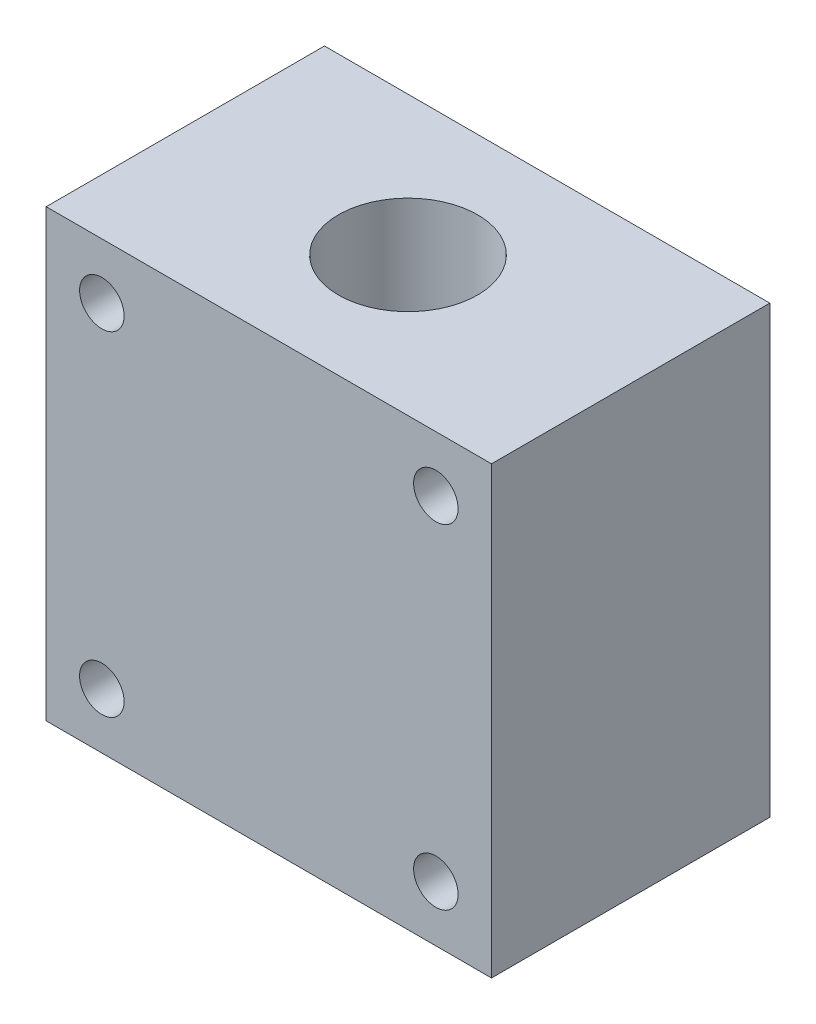
ISO-10303-21;
HEADER;
FILE_DESCRIPTION(('STEP AP214'),'2;1');
FILE_NAME('part.step','',(''),(''),'','','');
FILE_SCHEMA(('AUTOMOTIVE_DESIGN { 1 0 10303 214 1 1 1 1 }'));
ENDSEC;
DATA;
#1=APPLICATION_CONTEXT('core data for automotive mechanical design processes');
#2=APPLICATION_PROTOCOL_DEFINITION('international standard','automotive_design',2000,#1);
#3=PRODUCT_CONTEXT('',#1,'mechanical');
#4=PRODUCT('Part','Part','',(#3));
#5=PRODUCT_RELATED_PRODUCT_CATEGORY('part','',(#4));
#6=PRODUCT_DEFINITION_FORMATION('','',#4);
#7=PRODUCT_DEFINITION_CONTEXT('part definition',#1,'design');
#8=PRODUCT_DEFINITION('design','',#6,#7);
#9=PRODUCT_DEFINITION_SHAPE('','',#8);
#10=(LENGTH_UNIT() NAMED_UNIT(*) SI_UNIT(.MILLI.,.METRE.));
#11=(NAMED_UNIT(*) PLANE_ANGLE_UNIT() SI_UNIT($,.RADIAN.));
#12=(NAMED_UNIT(*) SI_UNIT($,.STERADIAN.) SOLID_ANGLE_UNIT());
#13=UNCERTAINTY_MEASURE_WITH_UNIT(LENGTH_MEASURE(1.E-05),#10,'distance_accuracy_value','');
#14=(GEOMETRIC_REPRESENTATION_CONTEXT(3) GLOBAL_UNCERTAINTY_ASSIGNED_CONTEXT((#13)) GLOBAL_UNIT_ASSIGNED_CONTEXT((#10,
#11,#12)) REPRESENTATION_CONTEXT('',''));
#15=CARTESIAN_POINT('',(0.,0.,0.));
#16=DIRECTION('',(0.,0.,1.));
#17=DIRECTION('',(1.,0.,0.));
#18=AXIS2_PLACEMENT_3D('',#15,#16,#17);
#19=CARTESIAN_POINT('',(-40.,80.,25.));
#20=DIRECTION('',(1.,0.,0.));
#21=DIRECTION('',(0.,0.,-1.));
#22=AXIS2_PLACEMENT_3D('',#19,#20,#21);
#23=PLANE('',#22);
#24=DIRECTION('',(0.,0.,1.));
#25=VECTOR('',#24,1.);
#26=CARTESIAN_POINT('',(-40.,0.,25.));
#27=LINE('',#26,#25);
#28=CARTESIAN_POINT('',(-40.,0.,-25.));
#29=VERTEX_POINT('',#28);
#30=CARTESIAN_POINT('',(-40.,0.,25.));
#31=VERTEX_POINT('',#30);
#32=EDGE_CURVE('E102',#29,#31,#27,.T.);
#33=ORIENTED_EDGE('',*,*,#32,.T.);
#34=DIRECTION('',(0.,-1.,0.));
#35=VECTOR('',#34,1.);
#36=CARTESIAN_POINT('',(-40.,80.,25.));
#37=LINE('',#36,#35);
#38=CARTESIAN_POINT('',(-40.,80.,25.));
#39=VERTEX_POINT('',#38);
#40=EDGE_CURVE('E12',#39,#31,#37,.T.);
#41=ORIENTED_EDGE('',*,*,#40,.F.);
#42=DIRECTION('',(0.,0.,1.));
#43=VECTOR('',#42,1.);
#44=CARTESIAN_POINT('',(-40.,80.,25.));
#45=LINE('',#44,#43);
#46=CARTESIAN_POINT('',(-40.,80.,-25.));
#47=VERTEX_POINT('',#46);
#48=EDGE_CURVE('E90',#47,#39,#45,.T.);
#49=ORIENTED_EDGE('',*,*,#48,.F.);
#50=DIRECTION('',(0.,-1.,0.));
#51=VECTOR('',#50,1.);
#52=CARTESIAN_POINT('',(-40.,80.,-25.));
#53=LINE('',#52,#51);
#54=EDGE_CURVE('E98',#47,#29,#53,.T.);
#55=ORIENTED_EDGE('',*,*,#54,.T.);
#56=EDGE_LOOP('',(#33,#41,#49,#55));
#57=FACE_BOUND('',#56,.T.);
#58=ADVANCED_FACE('F39',(#57),#23,.F.);
#59=CARTESIAN_POINT('',(40.,80.,25.));
#60=DIRECTION('',(0.,0.,-1.));
#61=DIRECTION('',(-1.,0.,0.));
#62=AXIS2_PLACEMENT_3D('',#59,#60,#61);
#63=PLANE('',#62);
#64=CARTESIAN_POINT('',(30.,70.,25.));
#65=DIRECTION('',(0.,0.,1.));
#66=DIRECTION('',(1.,0.,0.));
#67=AXIS2_PLACEMENT_3D('',#64,#65,#66);
#68=CIRCLE('',#67,4.00000000000001);
#69=CARTESIAN_POINT('',(34.,70.,25.));
#70=VERTEX_POINT('',#69);
#71=EDGE_CURVE('E131',#70,#70,#68,.T.);
#72=ORIENTED_EDGE('',*,*,#71,.F.);
#73=EDGE_LOOP('',(#72));
#74=FACE_BOUND('',#73,.T.);
#75=CARTESIAN_POINT('',(30.,10.,25.));
#76=DIRECTION('',(0.,0.,1.));
#77=DIRECTION('',(1.,0.,0.));
#78=AXIS2_PLACEMENT_3D('',#75,#76,#77);
#79=CIRCLE('',#78,4.);
#80=CARTESIAN_POINT('',(34.,10.,25.));
#81=VERTEX_POINT('',#80);
#82=EDGE_CURVE('E137',#81,#81,#79,.T.);
#83=ORIENTED_EDGE('',*,*,#82,.F.);
#84=EDGE_LOOP('',(#83));
#85=FACE_BOUND('',#84,.T.);
#86=CARTESIAN_POINT('',(-30.,10.,25.));
#87=DIRECTION('',(0.,0.,1.));
#88=DIRECTION('',(1.,0.,0.));
#89=AXIS2_PLACEMENT_3D('',#86,#87,#88);
#90=CIRCLE('',#89,4.);
#91=CARTESIAN_POINT('',(-26.,10.,25.));
#92=VERTEX_POINT('',#91);
#93=EDGE_CURVE('E125',#92,#92,#90,.T.);
#94=ORIENTED_EDGE('',*,*,#93,.F.);
#95=EDGE_LOOP('',(#94));
#96=FACE_BOUND('',#95,.T.);
#97=CARTESIAN_POINT('',(-30.,70.,25.));
#98=DIRECTION('',(0.,0.,1.));
#99=DIRECTION('',(1.,0.,0.));
#100=AXIS2_PLACEMENT_3D('',#97,#98,#99);
#101=CIRCLE('',#100,4.);
#102=CARTESIAN_POINT('',(-26.,70.,25.));
#103=VERTEX_POINT('',#102);
#104=EDGE_CURVE('E122',#103,#103,#101,.T.);
#105=ORIENTED_EDGE('',*,*,#104,.F.);
#106=EDGE_LOOP('',(#105));
#107=FACE_BOUND('',#106,.T.);
#108=DIRECTION('',(1.,0.,0.));
#109=VECTOR('',#108,1.);
#110=CARTESIAN_POINT('',(40.,0.,25.));
#111=LINE('',#110,#109);
#112=CARTESIAN_POINT('',(40.,0.,25.));
#113=VERTEX_POINT('',#112);
#114=EDGE_CURVE('E94',#31,#113,#111,.T.);
#115=ORIENTED_EDGE('',*,*,#114,.T.);
#116=DIRECTION('',(0.,-1.,0.));
#117=VECTOR('',#116,1.);
#118=CARTESIAN_POINT('',(40.,80.,25.));
#119=LINE('',#118,#117);
#120=CARTESIAN_POINT('',(40.,80.,25.));
#121=VERTEX_POINT('',#120);
#122=EDGE_CURVE('E47',#121,#113,#119,.T.);
#123=ORIENTED_EDGE('',*,*,#122,.F.);
#124=DIRECTION('',(1.,0.,0.));
#125=VECTOR('',#124,1.);
#126=CARTESIAN_POINT('',(40.,80.,25.));
#127=LINE('',#126,#125);
#128=EDGE_CURVE('E85',#39,#121,#127,.T.);
#129=ORIENTED_EDGE('',*,*,#128,.F.);
#130=ORIENTED_EDGE('',*,*,#40,.T.);
#131=EDGE_LOOP('',(#115,#123,#129,#130));
#132=FACE_BOUND('',#131,.T.);
#133=ADVANCED_FACE('F93',(#74,#85,#96,#107,#132),#63,.F.);
#134=CARTESIAN_POINT('',(40.,80.,25.));
#135=DIRECTION('',(-1.,0.,0.));
#136=DIRECTION('',(0.,0.,1.));
#137=AXIS2_PLACEMENT_3D('',#134,#135,#136);
#138=PLANE('',#137);
#139=DIRECTION('',(0.,0.,-1.));
#140=VECTOR('',#139,1.);
#141=CARTESIAN_POINT('',(40.,0.,25.));
#142=LINE('',#141,#140);
#143=CARTESIAN_POINT('',(40.,0.,-25.));
#144=VERTEX_POINT('',#143);
#145=EDGE_CURVE('E72',#113,#144,#142,.T.);
#146=ORIENTED_EDGE('',*,*,#145,.T.);
#147=DIRECTION('',(0.,-1.,0.));
#148=VECTOR('',#147,1.);
#149=CARTESIAN_POINT('',(40.,80.,-25.));
#150=LINE('',#149,#148);
#151=CARTESIAN_POINT('',(40.,80.,-25.));
#152=VERTEX_POINT('',#151);
#153=EDGE_CURVE('E95',#152,#144,#150,.T.);
#154=ORIENTED_EDGE('',*,*,#153,.F.);
#155=DIRECTION('',(0.,0.,-1.));
#156=VECTOR('',#155,1.);
#157=CARTESIAN_POINT('',(40.,80.,25.));
#158=LINE('',#157,#156);
#159=EDGE_CURVE('E88',#121,#152,#158,.T.);
#160=ORIENTED_EDGE('',*,*,#159,.F.);
#161=ORIENTED_EDGE('',*,*,#122,.T.);
#162=EDGE_LOOP('',(#146,#154,#160,#161));
#163=FACE_BOUND('',#162,.T.);
#164=ADVANCED_FACE('F96',(#163),#138,.F.);
#165=CARTESIAN_POINT('',(40.,80.,-25.));
#166=DIRECTION('',(0.,0.,1.));
#167=DIRECTION('',(1.,0.,0.));
#168=AXIS2_PLACEMENT_3D('',#165,#166,#167);
#169=PLANE('',#168);
#170=CARTESIAN_POINT('',(30.,70.,-25.));
#171=DIRECTION('',(0.,0.,1.));
#172=DIRECTION('',(1.,0.,0.));
#173=AXIS2_PLACEMENT_3D('',#170,#171,#172);
#174=CIRCLE('',#173,4.00000000000001);
#175=CARTESIAN_POINT('',(34.,70.,-25.));
#176=VERTEX_POINT('',#175);
#177=EDGE_CURVE('E128',#176,#176,#174,.T.);
#178=ORIENTED_EDGE('',*,*,#177,.T.);
#179=EDGE_LOOP('',(#178));
#180=FACE_BOUND('',#179,.T.);
#181=CARTESIAN_POINT('',(30.,10.,-25.));
#182=DIRECTION('',(0.,0.,1.));
#183=DIRECTION('',(1.,0.,0.));
#184=AXIS2_PLACEMENT_3D('',#181,#182,#183);
#185=CIRCLE('',#184,4.);
#186=CARTESIAN_POINT('',(34.,10.,-25.));
#187=VERTEX_POINT('',#186);
#188=EDGE_CURVE('E134',#187,#187,#185,.T.);
#189=ORIENTED_EDGE('',*,*,#188,.T.);
#190=EDGE_LOOP('',(#189));
#191=FACE_BOUND('',#190,.T.);
#192=CARTESIAN_POINT('',(-30.,10.,-25.));
#193=DIRECTION('',(0.,0.,1.));
#194=DIRECTION('',(1.,0.,0.));
#195=AXIS2_PLACEMENT_3D('',#192,#193,#194);
#196=CIRCLE('',#195,4.);
#197=CARTESIAN_POINT('',(-26.,10.,-25.));
#198=VERTEX_POINT('',#197);
#199=EDGE_CURVE('E140',#198,#198,#196,.T.);
#200=ORIENTED_EDGE('',*,*,#199,.T.);
#201=EDGE_LOOP('',(#200));
#202=FACE_BOUND('',#201,.T.);
#203=CARTESIAN_POINT('',(-30.,70.,-25.));
#204=DIRECTION('',(0.,0.,1.));
#205=DIRECTION('',(1.,0.,0.));
#206=AXIS2_PLACEMENT_3D('',#203,#204,#205);
#207=CIRCLE('',#206,4.);
#208=CARTESIAN_POINT('',(-26.,70.,-25.));
#209=VERTEX_POINT('',#208);
#210=EDGE_CURVE('E119',#209,#209,#207,.T.);
#211=ORIENTED_EDGE('',*,*,#210,.T.);
#212=EDGE_LOOP('',(#211));
#213=FACE_BOUND('',#212,.T.);
#214=DIRECTION('',(-1.,0.,0.));
#215=VECTOR('',#214,1.);
#216=CARTESIAN_POINT('',(40.,0.,-25.));
#217=LINE('',#216,#215);
#218=EDGE_CURVE('E78',#144,#29,#217,.T.);
#219=ORIENTED_EDGE('',*,*,#218,.T.);
#220=ORIENTED_EDGE('',*,*,#54,.F.);
#221=DIRECTION('',(-1.,0.,0.));
#222=VECTOR('',#221,1.);
#223=CARTESIAN_POINT('',(40.,80.,-25.));
#224=LINE('',#223,#222);
#225=EDGE_CURVE('E55',#152,#47,#224,.T.);
#226=ORIENTED_EDGE('',*,*,#225,.F.);
#227=ORIENTED_EDGE('',*,*,#153,.T.);
#228=EDGE_LOOP('',(#219,#220,#226,#227));
#229=FACE_BOUND('',#228,.T.);
#230=ADVANCED_FACE('F110',(#180,#191,#202,#213,#229),#169,.F.);
#231=CARTESIAN_POINT('',(0.,80.,0.));
#232=DIRECTION('',(0.,1.,0.));
#233=DIRECTION('',(0.,0.,1.));
#234=AXIS2_PLACEMENT_3D('',#231,#232,#233);
#235=PLANE('',#234);
#236=CARTESIAN_POINT('',(0.,80.,0.));
#237=DIRECTION('',(0.,1.,0.));
#238=DIRECTION('',(0.,0.,1.));
#239=AXIS2_PLACEMENT_3D('',#236,#237,#238);
#240=CIRCLE('',#239,12.5);
#241=CARTESIAN_POINT('',(0.,80.,12.5));
#242=VERTEX_POINT('',#241);
#243=EDGE_CURVE('E116',#242,#242,#240,.T.);
#244=ORIENTED_EDGE('',*,*,#243,.F.);
#245=EDGE_LOOP('',(#244));
#246=FACE_BOUND('',#245,.T.);
#247=ORIENTED_EDGE('',*,*,#48,.T.);
#248=ORIENTED_EDGE('',*,*,#128,.T.);
#249=ORIENTED_EDGE('',*,*,#159,.T.);
#250=ORIENTED_EDGE('',*,*,#225,.T.);
#251=EDGE_LOOP('',(#247,#248,#249,#250));
#252=FACE_BOUND('',#251,.T.);
#253=ADVANCED_FACE('F86',(#246,#252),#235,.T.);
#254=CARTESIAN_POINT('',(0.,0.,0.));
#255=DIRECTION('',(0.,1.,0.));
#256=DIRECTION('',(0.,0.,1.));
#257=AXIS2_PLACEMENT_3D('',#254,#255,#256);
#258=PLANE('',#257);
#259=CARTESIAN_POINT('',(0.,0.,0.));
#260=DIRECTION('',(0.,1.,0.));
#261=DIRECTION('',(0.,0.,1.));
#262=AXIS2_PLACEMENT_3D('',#259,#260,#261);
#263=CIRCLE('',#262,12.5);
#264=CARTESIAN_POINT('',(0.,0.,12.5));
#265=VERTEX_POINT('',#264);
#266=EDGE_CURVE('E105',#265,#265,#263,.T.);
#267=ORIENTED_EDGE('',*,*,#266,.T.);
#268=EDGE_LOOP('',(#267));
#269=FACE_BOUND('',#268,.T.);
#270=ORIENTED_EDGE('',*,*,#32,.F.);
#271=ORIENTED_EDGE('',*,*,#218,.F.);
#272=ORIENTED_EDGE('',*,*,#145,.F.);
#273=ORIENTED_EDGE('',*,*,#114,.F.);
#274=EDGE_LOOP('',(#270,#271,#272,#273));
#275=FACE_BOUND('',#274,.T.);
#276=ADVANCED_FACE('F113',(#269,#275),#258,.F.);
#277=CARTESIAN_POINT('',(0.,0.,0.));
#278=DIRECTION('',(0.,1.,0.));
#279=DIRECTION('',(0.,0.,1.));
#280=AXIS2_PLACEMENT_3D('',#277,#278,#279);
#281=CYLINDRICAL_SURFACE('',#280,12.5);
#282=ORIENTED_EDGE('',*,*,#266,.F.);
#283=EDGE_LOOP('',(#282));
#284=FACE_BOUND('',#283,.T.);
#285=ORIENTED_EDGE('',*,*,#243,.T.);
#286=EDGE_LOOP('',(#285));
#287=FACE_BOUND('',#286,.T.);
#288=ADVANCED_FACE('F155',(#284,#287),#281,.F.);
#289=CARTESIAN_POINT('',(-30.,70.,-25.));
#290=DIRECTION('',(0.,0.,1.));
#291=DIRECTION('',(1.,0.,0.));
#292=AXIS2_PLACEMENT_3D('',#289,#290,#291);
#293=CYLINDRICAL_SURFACE('',#292,4.);
#294=ORIENTED_EDGE('',*,*,#210,.F.);
#295=EDGE_LOOP('',(#294));
#296=FACE_BOUND('',#295,.T.);
#297=ORIENTED_EDGE('',*,*,#104,.T.);
#298=EDGE_LOOP('',(#297));
#299=FACE_BOUND('',#298,.T.);
#300=ADVANCED_FACE('F153',(#296,#299),#293,.F.);
#301=CARTESIAN_POINT('',(-30.,10.,-25.));
#302=DIRECTION('',(0.,0.,1.));
#303=DIRECTION('',(1.,0.,0.));
#304=AXIS2_PLACEMENT_3D('',#301,#302,#303);
#305=CYLINDRICAL_SURFACE('',#304,4.);
#306=ORIENTED_EDGE('',*,*,#199,.F.);
#307=EDGE_LOOP('',(#306));
#308=FACE_BOUND('',#307,.T.);
#309=ORIENTED_EDGE('',*,*,#93,.T.);
#310=EDGE_LOOP('',(#309));
#311=FACE_BOUND('',#310,.T.);
#312=ADVANCED_FACE('F146',(#308,#311),#305,.F.);
#313=CARTESIAN_POINT('',(30.,10.,-25.));
#314=DIRECTION('',(0.,0.,1.));
#315=DIRECTION('',(1.,0.,0.));
#316=AXIS2_PLACEMENT_3D('',#313,#314,#315);
#317=CYLINDRICAL_SURFACE('',#316,4.);
#318=ORIENTED_EDGE('',*,*,#188,.F.);
#319=EDGE_LOOP('',(#318));
#320=FACE_BOUND('',#319,.T.);
#321=ORIENTED_EDGE('',*,*,#82,.T.);
#322=EDGE_LOOP('',(#321));
#323=FACE_BOUND('',#322,.T.);
#324=ADVANCED_FACE('F162',(#320,#323),#317,.F.);
#325=CARTESIAN_POINT('',(30.,70.,-25.));
#326=DIRECTION('',(0.,0.,1.));
#327=DIRECTION('',(1.,0.,0.));
#328=AXIS2_PLACEMENT_3D('',#325,#326,#327);
#329=CYLINDRICAL_SURFACE('',#328,4.00000000000001);
#330=ORIENTED_EDGE('',*,*,#177,.F.);
#331=EDGE_LOOP('',(#330));
#332=FACE_BOUND('',#331,.T.);
#333=ORIENTED_EDGE('',*,*,#71,.T.);
#334=EDGE_LOOP('',(#333));
#335=FACE_BOUND('',#334,.T.);
#336=ADVANCED_FACE('F228',(#332,#335),#329,.F.);
#337=CLOSED_SHELL('',(#58,#133,#164,#230,#253,#276,#288,#300,#312,#324,#336));
#338=MANIFOLD_SOLID_BREP('B2',#337);
#339=ADVANCED_BREP_SHAPE_REPRESENTATION('',(#18,#338),#14);
#340=SHAPE_DEFINITION_REPRESENTATION(#9,#339);
ENDSEC;
END-ISO-10303-21;
